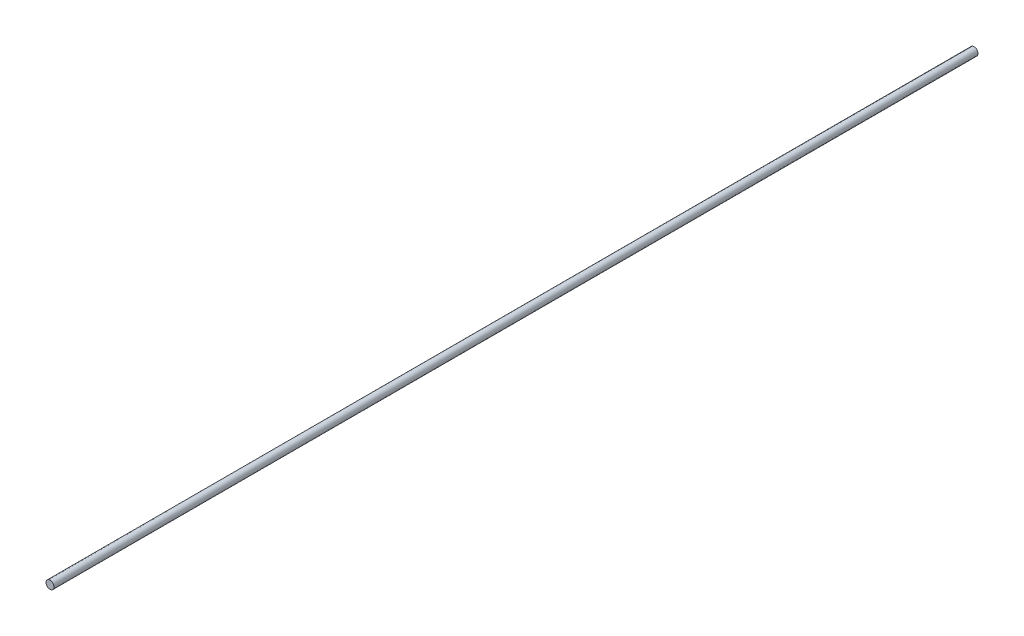
ISO-10303-21;
HEADER;
FILE_DESCRIPTION(('STEP AP214'),'2;1');
FILE_NAME('part.step','',(''),(''),'','','');
FILE_SCHEMA(('AUTOMOTIVE_DESIGN { 1 0 10303 214 1 1 1 1 }'));
ENDSEC;
DATA;
#1=APPLICATION_CONTEXT('core data for automotive mechanical design processes');
#2=APPLICATION_PROTOCOL_DEFINITION('international standard','automotive_design',2000,#1);
#3=PRODUCT_CONTEXT('',#1,'mechanical');
#4=PRODUCT('Part','Part','',(#3));
#5=PRODUCT_RELATED_PRODUCT_CATEGORY('part','',(#4));
#6=PRODUCT_DEFINITION_FORMATION('','',#4);
#7=PRODUCT_DEFINITION_CONTEXT('part definition',#1,'design');
#8=PRODUCT_DEFINITION('design','',#6,#7);
#9=PRODUCT_DEFINITION_SHAPE('','',#8);
#10=(LENGTH_UNIT() NAMED_UNIT(*) SI_UNIT(.MILLI.,.METRE.));
#11=(NAMED_UNIT(*) PLANE_ANGLE_UNIT() SI_UNIT($,.RADIAN.));
#12=(NAMED_UNIT(*) SI_UNIT($,.STERADIAN.) SOLID_ANGLE_UNIT());
#13=UNCERTAINTY_MEASURE_WITH_UNIT(LENGTH_MEASURE(1.E-05),#10,'distance_accuracy_value','');
#14=(GEOMETRIC_REPRESENTATION_CONTEXT(3) GLOBAL_UNCERTAINTY_ASSIGNED_CONTEXT((#13)) GLOBAL_UNIT_ASSIGNED_CONTEXT((#10,
#11,#12)) REPRESENTATION_CONTEXT('',''));
#15=CARTESIAN_POINT('',(0.,0.,0.));
#16=DIRECTION('',(0.,0.,1.));
#17=DIRECTION('',(1.,0.,0.));
#18=AXIS2_PLACEMENT_3D('',#15,#16,#17);
#19=CARTESIAN_POINT('',(0.,0.,350.));
#20=DIRECTION('',(0.,0.,-1.));
#21=DIRECTION('',(-1.,0.,0.));
#22=AXIS2_PLACEMENT_3D('',#19,#20,#21);
#23=CYLINDRICAL_SURFACE('',#22,1.5);
#24=CARTESIAN_POINT('',(0.,0.,350.));
#25=DIRECTION('',(0.,0.,-1.));
#26=DIRECTION('',(-1.,0.,0.));
#27=AXIS2_PLACEMENT_3D('',#24,#25,#26);
#28=CIRCLE('',#27,1.5);
#29=CARTESIAN_POINT('',(-1.5,0.,350.));
#30=VERTEX_POINT('',#29);
#31=EDGE_CURVE('E10',#30,#30,#28,.T.);
#32=ORIENTED_EDGE('',*,*,#31,.T.);
#33=EDGE_LOOP('',(#32));
#34=FACE_BOUND('',#33,.T.);
#35=CARTESIAN_POINT('',(0.,0.,0.));
#36=DIRECTION('',(0.,0.,-1.));
#37=DIRECTION('',(-1.,0.,0.));
#38=AXIS2_PLACEMENT_3D('',#35,#36,#37);
#39=CIRCLE('',#38,1.5);
#40=CARTESIAN_POINT('',(-1.5,0.,0.));
#41=VERTEX_POINT('',#40);
#42=EDGE_CURVE('E45',#41,#41,#39,.T.);
#43=ORIENTED_EDGE('',*,*,#42,.F.);
#44=EDGE_LOOP('',(#43));
#45=FACE_BOUND('',#44,.T.);
#46=ADVANCED_FACE('F39',(#34,#45),#23,.T.);
#47=CARTESIAN_POINT('',(1.5,0.,350.));
#48=DIRECTION('',(0.,0.,1.));
#49=DIRECTION('',(1.,0.,0.));
#50=AXIS2_PLACEMENT_3D('',#47,#48,#49);
#51=PLANE('',#50);
#52=ORIENTED_EDGE('',*,*,#31,.F.);
#53=EDGE_LOOP('',(#52));
#54=FACE_BOUND('',#53,.T.);
#55=ADVANCED_FACE('F54',(#54),#51,.T.);
#56=CARTESIAN_POINT('',(0.,0.,0.));
#57=DIRECTION('',(0.,0.,-1.));
#58=DIRECTION('',(-1.,0.,0.));
#59=AXIS2_PLACEMENT_3D('',#56,#57,#58);
#60=PLANE('',#59);
#61=ORIENTED_EDGE('',*,*,#42,.T.);
#62=EDGE_LOOP('',(#61));
#63=FACE_BOUND('',#62,.T.);
#64=ADVANCED_FACE('F51',(#63),#60,.T.);
#65=CLOSED_SHELL('',(#46,#55,#64));
#66=MANIFOLD_SOLID_BREP('B2',#65);
#67=ADVANCED_BREP_SHAPE_REPRESENTATION('',(#18,#66),#14);
#68=SHAPE_DEFINITION_REPRESENTATION(#9,#67);
ENDSEC;
END-ISO-10303-21;
